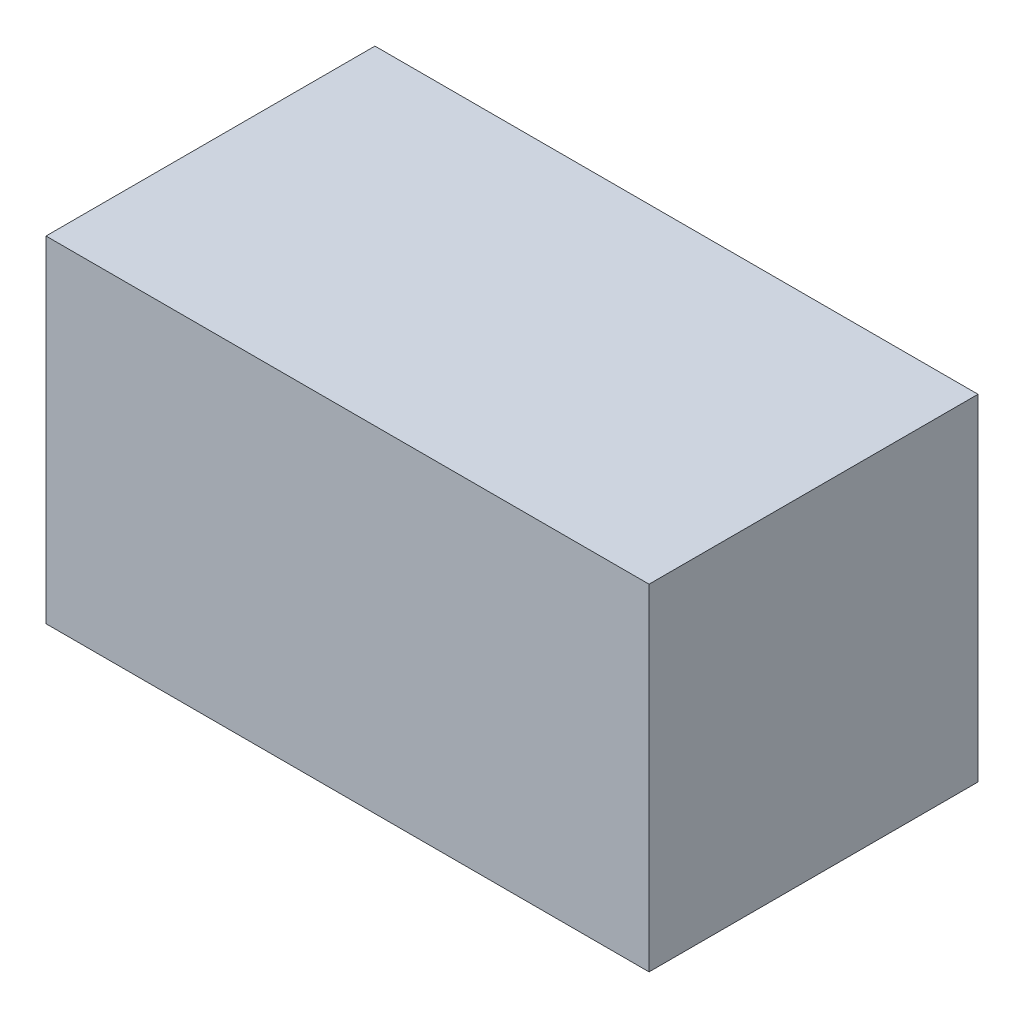
ISO-10303-21;
HEADER;
FILE_DESCRIPTION(('STEP AP214'),'2;1');
FILE_NAME('part.step','',(''),(''),'','','');
FILE_SCHEMA(('AUTOMOTIVE_DESIGN { 1 0 10303 214 1 1 1 1 }'));
ENDSEC;
DATA;
#1=APPLICATION_CONTEXT('core data for automotive mechanical design processes');
#2=APPLICATION_PROTOCOL_DEFINITION('international standard','automotive_design',2000,#1);
#3=PRODUCT_CONTEXT('',#1,'mechanical');
#4=PRODUCT('Part','Part','',(#3));
#5=PRODUCT_RELATED_PRODUCT_CATEGORY('part','',(#4));
#6=PRODUCT_DEFINITION_FORMATION('','',#4);
#7=PRODUCT_DEFINITION_CONTEXT('part definition',#1,'design');
#8=PRODUCT_DEFINITION('design','',#6,#7);
#9=PRODUCT_DEFINITION_SHAPE('','',#8);
#10=(LENGTH_UNIT() NAMED_UNIT(*) SI_UNIT(.MILLI.,.METRE.));
#11=(NAMED_UNIT(*) PLANE_ANGLE_UNIT() SI_UNIT($,.RADIAN.));
#12=(NAMED_UNIT(*) SI_UNIT($,.STERADIAN.) SOLID_ANGLE_UNIT());
#13=UNCERTAINTY_MEASURE_WITH_UNIT(LENGTH_MEASURE(1.E-05),#10,'distance_accuracy_value','');
#14=(GEOMETRIC_REPRESENTATION_CONTEXT(3) GLOBAL_UNCERTAINTY_ASSIGNED_CONTEXT((#13)) GLOBAL_UNIT_ASSIGNED_CONTEXT((#10,
#11,#12)) REPRESENTATION_CONTEXT('',''));
#15=CARTESIAN_POINT('',(0.,0.,0.));
#16=DIRECTION('',(0.,0.,1.));
#17=DIRECTION('',(1.,0.,0.));
#18=AXIS2_PLACEMENT_3D('',#15,#16,#17);
#19=CARTESIAN_POINT('',(88.,98.,48.));
#20=DIRECTION('',(-1.,0.,0.));
#21=DIRECTION('',(0.,0.,1.));
#22=AXIS2_PLACEMENT_3D('',#19,#20,#21);
#23=PLANE('',#22);
#24=DIRECTION('',(0.,0.,-1.));
#25=VECTOR('',#24,1.);
#26=CARTESIAN_POINT('',(88.,0.,48.));
#27=LINE('',#26,#25);
#28=CARTESIAN_POINT('',(88.,0.,48.));
#29=VERTEX_POINT('',#28);
#30=CARTESIAN_POINT('',(88.,0.,-48.));
#31=VERTEX_POINT('',#30);
#32=EDGE_CURVE('E113',#29,#31,#27,.T.);
#33=ORIENTED_EDGE('',*,*,#32,.T.);
#34=DIRECTION('',(0.,-1.,0.));
#35=VECTOR('',#34,1.);
#36=CARTESIAN_POINT('',(88.,98.,-48.));
#37=LINE('',#36,#35);
#38=CARTESIAN_POINT('',(88.,98.,-48.));
#39=VERTEX_POINT('',#38);
#40=EDGE_CURVE('E11',#39,#31,#37,.T.);
#41=ORIENTED_EDGE('',*,*,#40,.F.);
#42=DIRECTION('',(0.,0.,-1.));
#43=VECTOR('',#42,1.);
#44=CARTESIAN_POINT('',(88.,98.,48.));
#45=LINE('',#44,#43);
#46=CARTESIAN_POINT('',(88.,98.,48.));
#47=VERTEX_POINT('',#46);
#48=EDGE_CURVE('E97',#47,#39,#45,.T.);
#49=ORIENTED_EDGE('',*,*,#48,.F.);
#50=DIRECTION('',(0.,-1.,0.));
#51=VECTOR('',#50,1.);
#52=CARTESIAN_POINT('',(88.,98.,48.));
#53=LINE('',#52,#51);
#54=EDGE_CURVE('E109',#47,#29,#53,.T.);
#55=ORIENTED_EDGE('',*,*,#54,.T.);
#56=EDGE_LOOP('',(#33,#41,#49,#55));
#57=FACE_BOUND('',#56,.T.);
#58=ADVANCED_FACE('F45',(#57),#23,.F.);
#59=CARTESIAN_POINT('',(-88.,98.,-48.));
#60=DIRECTION('',(0.,0.,1.));
#61=DIRECTION('',(1.,0.,0.));
#62=AXIS2_PLACEMENT_3D('',#59,#60,#61);
#63=PLANE('',#62);
#64=DIRECTION('',(-1.,0.,0.));
#65=VECTOR('',#64,1.);
#66=CARTESIAN_POINT('',(-88.,0.,-48.));
#67=LINE('',#66,#65);
#68=CARTESIAN_POINT('',(-88.,0.,-48.));
#69=VERTEX_POINT('',#68);
#70=EDGE_CURVE('E102',#31,#69,#67,.T.);
#71=ORIENTED_EDGE('',*,*,#70,.T.);
#72=DIRECTION('',(0.,-1.,0.));
#73=VECTOR('',#72,1.);
#74=CARTESIAN_POINT('',(-88.,98.,-48.));
#75=LINE('',#74,#73);
#76=CARTESIAN_POINT('',(-88.,98.,-48.));
#77=VERTEX_POINT('',#76);
#78=EDGE_CURVE('E54',#77,#69,#75,.T.);
#79=ORIENTED_EDGE('',*,*,#78,.F.);
#80=DIRECTION('',(-1.,0.,0.));
#81=VECTOR('',#80,1.);
#82=CARTESIAN_POINT('',(-88.,98.,-48.));
#83=LINE('',#82,#81);
#84=EDGE_CURVE('E92',#39,#77,#83,.T.);
#85=ORIENTED_EDGE('',*,*,#84,.F.);
#86=ORIENTED_EDGE('',*,*,#40,.T.);
#87=EDGE_LOOP('',(#71,#79,#85,#86));
#88=FACE_BOUND('',#87,.T.);
#89=ADVANCED_FACE('F101',(#88),#63,.F.);
#90=CARTESIAN_POINT('',(-88.,98.,48.));
#91=DIRECTION('',(1.,0.,0.));
#92=DIRECTION('',(0.,0.,-1.));
#93=AXIS2_PLACEMENT_3D('',#90,#91,#92);
#94=PLANE('',#93);
#95=DIRECTION('',(0.,0.,1.));
#96=VECTOR('',#95,1.);
#97=CARTESIAN_POINT('',(-88.,0.,48.));
#98=LINE('',#97,#96);
#99=CARTESIAN_POINT('',(-88.,0.,48.));
#100=VERTEX_POINT('',#99);
#101=EDGE_CURVE('E79',#69,#100,#98,.T.);
#102=ORIENTED_EDGE('',*,*,#101,.T.);
#103=DIRECTION('',(0.,-1.,0.));
#104=VECTOR('',#103,1.);
#105=CARTESIAN_POINT('',(-88.,98.,48.));
#106=LINE('',#105,#104);
#107=CARTESIAN_POINT('',(-88.,98.,48.));
#108=VERTEX_POINT('',#107);
#109=EDGE_CURVE('E104',#108,#100,#106,.T.);
#110=ORIENTED_EDGE('',*,*,#109,.F.);
#111=DIRECTION('',(0.,0.,1.));
#112=VECTOR('',#111,1.);
#113=CARTESIAN_POINT('',(-88.,98.,48.));
#114=LINE('',#113,#112);
#115=EDGE_CURVE('E95',#77,#108,#114,.T.);
#116=ORIENTED_EDGE('',*,*,#115,.F.);
#117=ORIENTED_EDGE('',*,*,#78,.T.);
#118=EDGE_LOOP('',(#102,#110,#116,#117));
#119=FACE_BOUND('',#118,.T.);
#120=ADVANCED_FACE('F105',(#119),#94,.F.);
#121=CARTESIAN_POINT('',(-88.,98.,48.));
#122=DIRECTION('',(0.,0.,-1.));
#123=DIRECTION('',(-1.,0.,0.));
#124=AXIS2_PLACEMENT_3D('',#121,#122,#123);
#125=PLANE('',#124);
#126=DIRECTION('',(1.,0.,0.));
#127=VECTOR('',#126,1.);
#128=CARTESIAN_POINT('',(-88.,0.,48.));
#129=LINE('',#128,#127);
#130=EDGE_CURVE('E85',#100,#29,#129,.T.);
#131=ORIENTED_EDGE('',*,*,#130,.T.);
#132=ORIENTED_EDGE('',*,*,#54,.F.);
#133=DIRECTION('',(1.,0.,0.));
#134=VECTOR('',#133,1.);
#135=CARTESIAN_POINT('',(-88.,98.,48.));
#136=LINE('',#135,#134);
#137=EDGE_CURVE('E62',#108,#47,#136,.T.);
#138=ORIENTED_EDGE('',*,*,#137,.F.);
#139=ORIENTED_EDGE('',*,*,#109,.T.);
#140=EDGE_LOOP('',(#131,#132,#138,#139));
#141=FACE_BOUND('',#140,.T.);
#142=ADVANCED_FACE('F126',(#141),#125,.F.);
#143=CARTESIAN_POINT('',(0.,98.,0.));
#144=DIRECTION('',(0.,-1.,0.));
#145=DIRECTION('',(0.,0.,-1.));
#146=AXIS2_PLACEMENT_3D('',#143,#144,#145);
#147=PLANE('',#146);
#148=ORIENTED_EDGE('',*,*,#48,.T.);
#149=ORIENTED_EDGE('',*,*,#84,.T.);
#150=ORIENTED_EDGE('',*,*,#115,.T.);
#151=ORIENTED_EDGE('',*,*,#137,.T.);
#152=EDGE_LOOP('',(#148,#149,#150,#151));
#153=FACE_BOUND('',#152,.T.);
#154=ADVANCED_FACE('F93',(#153),#147,.F.);
#155=CARTESIAN_POINT('',(0.,0.,0.));
#156=DIRECTION('',(0.,-1.,0.));
#157=DIRECTION('',(0.,0.,-1.));
#158=AXIS2_PLACEMENT_3D('',#155,#156,#157);
#159=PLANE('',#158);
#160=ORIENTED_EDGE('',*,*,#32,.F.);
#161=ORIENTED_EDGE('',*,*,#130,.F.);
#162=ORIENTED_EDGE('',*,*,#101,.F.);
#163=ORIENTED_EDGE('',*,*,#70,.F.);
#164=EDGE_LOOP('',(#160,#161,#162,#163));
#165=FACE_BOUND('',#164,.T.);
#166=ADVANCED_FACE('F129',(#165),#159,.T.);
#167=CLOSED_SHELL('',(#58,#89,#120,#142,#154,#166));
#168=MANIFOLD_SOLID_BREP('B2',#167);
#169=ADVANCED_BREP_SHAPE_REPRESENTATION('',(#18,#168),#14);
#170=SHAPE_DEFINITION_REPRESENTATION(#9,#169);
ENDSEC;
END-ISO-10303-21;
